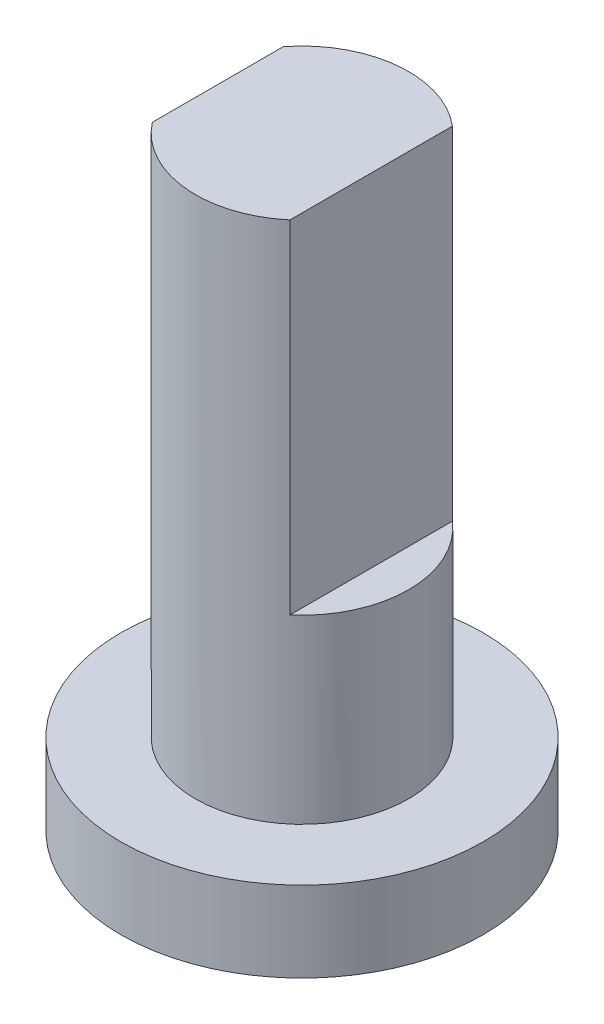
ISO-10303-21;
HEADER;
FILE_DESCRIPTION(('STEP AP214'),'2;1');
FILE_NAME('part.step','',(''),(''),'','','');
FILE_SCHEMA(('AUTOMOTIVE_DESIGN { 1 0 10303 214 1 1 1 1 }'));
ENDSEC;
DATA;
#1=APPLICATION_CONTEXT('core data for automotive mechanical design processes');
#2=APPLICATION_PROTOCOL_DEFINITION('international standard','automotive_design',2000,#1);
#3=PRODUCT_CONTEXT('',#1,'mechanical');
#4=PRODUCT('Part','Part','',(#3));
#5=PRODUCT_RELATED_PRODUCT_CATEGORY('part','',(#4));
#6=PRODUCT_DEFINITION_FORMATION('','',#4);
#7=PRODUCT_DEFINITION_CONTEXT('part definition',#1,'design');
#8=PRODUCT_DEFINITION('design','',#6,#7);
#9=PRODUCT_DEFINITION_SHAPE('','',#8);
#10=(LENGTH_UNIT() NAMED_UNIT(*) SI_UNIT(.MILLI.,.METRE.));
#11=(NAMED_UNIT(*) PLANE_ANGLE_UNIT() SI_UNIT($,.RADIAN.));
#12=(NAMED_UNIT(*) SI_UNIT($,.STERADIAN.) SOLID_ANGLE_UNIT());
#13=UNCERTAINTY_MEASURE_WITH_UNIT(LENGTH_MEASURE(1.E-05),#10,'distance_accuracy_value','');
#14=(GEOMETRIC_REPRESENTATION_CONTEXT(3) GLOBAL_UNCERTAINTY_ASSIGNED_CONTEXT((#13)) GLOBAL_UNIT_ASSIGNED_CONTEXT((#10,
#11,#12)) REPRESENTATION_CONTEXT('',''));
#15=CARTESIAN_POINT('',(0.,0.,0.));
#16=DIRECTION('',(0.,0.,1.));
#17=DIRECTION('',(1.,0.,0.));
#18=AXIS2_PLACEMENT_3D('',#15,#16,#17);
#19=CARTESIAN_POINT('',(0.,6.5,0.));
#20=DIRECTION('',(0.,1.,0.));
#21=DIRECTION('',(0.,0.,1.));
#22=AXIS2_PLACEMENT_3D('',#19,#20,#21);
#23=PLANE('',#22);
#24=DIRECTION('',(0.,0.,-1.));
#25=VECTOR('',#24,1.);
#26=CARTESIAN_POINT('',(1.7187276875559,6.5,2.0170461412741));
#27=LINE('',#26,#25);
#28=CARTESIAN_POINT('',(1.7187276875559,6.5,2.0170461412741));
#29=VERTEX_POINT('',#28);
#30=CARTESIAN_POINT('',(1.7187276875559,6.5,-2.0170461412741));
#31=VERTEX_POINT('',#30);
#32=EDGE_CURVE('E103',#29,#31,#27,.T.);
#33=ORIENTED_EDGE('',*,*,#32,.F.);
#34=CARTESIAN_POINT('',(0.,6.5,0.));
#35=DIRECTION('',(0.,1.,0.));
#36=DIRECTION('',(0.,0.,1.));
#37=AXIS2_PLACEMENT_3D('',#34,#35,#36);
#38=CIRCLE('',#37,2.65);
#39=EDGE_CURVE('E61',#29,#31,#38,.T.);
#40=ORIENTED_EDGE('',*,*,#39,.T.);
#41=EDGE_LOOP('',(#33,#40));
#42=FACE_BOUND('',#41,.T.);
#43=ADVANCED_FACE('F39',(#42),#23,.T.);
#44=CARTESIAN_POINT('',(0.,2.,0.));
#45=DIRECTION('',(0.,-1.,0.));
#46=DIRECTION('',(0.,0.,-1.));
#47=AXIS2_PLACEMENT_3D('',#44,#45,#46);
#48=CYLINDRICAL_SURFACE('',#47,4.5);
#49=CARTESIAN_POINT('',(0.,2.,0.));
#50=DIRECTION('',(0.,1.,0.));
#51=DIRECTION('',(0.,0.,1.));
#52=AXIS2_PLACEMENT_3D('',#49,#50,#51);
#53=CIRCLE('',#52,4.5);
#54=CARTESIAN_POINT('',(0.,2.,4.5));
#55=VERTEX_POINT('',#54);
#56=EDGE_CURVE('E48',#55,#55,#53,.T.);
#57=ORIENTED_EDGE('',*,*,#56,.F.);
#58=EDGE_LOOP('',(#57));
#59=FACE_BOUND('',#58,.T.);
#60=CARTESIAN_POINT('',(0.,0.,0.));
#61=DIRECTION('',(0.,1.,0.));
#62=DIRECTION('',(0.,0.,1.));
#63=AXIS2_PLACEMENT_3D('',#60,#61,#62);
#64=CIRCLE('',#63,4.5);
#65=CARTESIAN_POINT('',(0.,0.,4.5));
#66=VERTEX_POINT('',#65);
#67=EDGE_CURVE('E43',#66,#66,#64,.T.);
#68=ORIENTED_EDGE('',*,*,#67,.T.);
#69=EDGE_LOOP('',(#68));
#70=FACE_BOUND('',#69,.T.);
#71=ADVANCED_FACE('F41',(#59,#70),#48,.T.);
#72=CARTESIAN_POINT('',(0.,2.,0.));
#73=DIRECTION('',(0.,1.,0.));
#74=DIRECTION('',(0.,0.,1.));
#75=AXIS2_PLACEMENT_3D('',#72,#73,#74);
#76=PLANE('',#75);
#77=CARTESIAN_POINT('',(0.,2.,0.));
#78=DIRECTION('',(0.,1.,0.));
#79=DIRECTION('',(0.,0.,1.));
#80=AXIS2_PLACEMENT_3D('',#77,#78,#79);
#81=CIRCLE('',#80,2.65);
#82=CARTESIAN_POINT('',(0.,2.,2.65));
#83=VERTEX_POINT('',#82);
#84=EDGE_CURVE('E11',#83,#83,#81,.T.);
#85=ORIENTED_EDGE('',*,*,#84,.F.);
#86=EDGE_LOOP('',(#85));
#87=FACE_BOUND('',#86,.T.);
#88=ORIENTED_EDGE('',*,*,#56,.T.);
#89=EDGE_LOOP('',(#88));
#90=FACE_BOUND('',#89,.T.);
#91=ADVANCED_FACE('F119',(#87,#90),#76,.T.);
#92=CARTESIAN_POINT('',(0.,0.,0.));
#93=DIRECTION('',(0.,1.,0.));
#94=DIRECTION('',(0.,0.,1.));
#95=AXIS2_PLACEMENT_3D('',#92,#93,#94);
#96=PLANE('',#95);
#97=ORIENTED_EDGE('',*,*,#67,.F.);
#98=EDGE_LOOP('',(#97));
#99=FACE_BOUND('',#98,.T.);
#100=ADVANCED_FACE('F117',(#99),#96,.F.);
#101=CARTESIAN_POINT('',(0.,6.5,0.));
#102=DIRECTION('',(0.,-1.,0.));
#103=DIRECTION('',(0.,0.,-1.));
#104=AXIS2_PLACEMENT_3D('',#101,#102,#103);
#105=CYLINDRICAL_SURFACE('',#104,2.65);
#106=ORIENTED_EDGE('',*,*,#39,.F.);
#107=DIRECTION('',(0.,-1.,0.));
#108=VECTOR('',#107,1.);
#109=CARTESIAN_POINT('',(1.7187276875559,15.,2.0170461412741));
#110=LINE('',#109,#108);
#111=CARTESIAN_POINT('',(1.7187276875559,15.,2.0170461412741));
#112=VERTEX_POINT('',#111);
#113=EDGE_CURVE('E108',#112,#29,#110,.T.);
#114=ORIENTED_EDGE('',*,*,#113,.F.);
#115=CARTESIAN_POINT('',(0.,15.,0.));
#116=DIRECTION('',(0.,1.,0.));
#117=DIRECTION('',(0.,0.,1.));
#118=AXIS2_PLACEMENT_3D('',#115,#116,#117);
#119=CIRCLE('',#118,2.65);
#120=CARTESIAN_POINT('',(-2.0912723124441,15.,1.62759949471752));
#121=VERTEX_POINT('',#120);
#122=EDGE_CURVE('E92',#121,#112,#119,.T.);
#123=ORIENTED_EDGE('',*,*,#122,.F.);
#124=DIRECTION('',(0.,-1.,0.));
#125=VECTOR('',#124,1.);
#126=CARTESIAN_POINT('',(-2.0912723124441,15.,1.62759949471752));
#127=LINE('',#126,#125);
#128=CARTESIAN_POINT('',(-2.0912723124441,6.5,1.62759949471752));
#129=VERTEX_POINT('',#128);
#130=EDGE_CURVE('E90',#121,#129,#127,.T.);
#131=ORIENTED_EDGE('',*,*,#130,.T.);
#132=CARTESIAN_POINT('',(-2.0912723124441,6.5,-1.62759949471752));
#133=VERTEX_POINT('',#132);
#134=EDGE_CURVE('E102',#133,#129,#38,.T.);
#135=ORIENTED_EDGE('',*,*,#134,.F.);
#136=DIRECTION('',(0.,-1.,0.));
#137=VECTOR('',#136,1.);
#138=CARTESIAN_POINT('',(-2.0912723124441,15.,-1.62759949471752));
#139=LINE('',#138,#137);
#140=CARTESIAN_POINT('',(-2.0912723124441,15.,-1.62759949471752));
#141=VERTEX_POINT('',#140);
#142=EDGE_CURVE('E87',#141,#133,#139,.T.);
#143=ORIENTED_EDGE('',*,*,#142,.F.);
#144=CARTESIAN_POINT('',(0.,15.,0.));
#145=DIRECTION('',(0.,1.,0.));
#146=DIRECTION('',(0.,0.,1.));
#147=AXIS2_PLACEMENT_3D('',#144,#145,#146);
#148=CIRCLE('',#147,2.65);
#149=CARTESIAN_POINT('',(1.7187276875559,15.,-2.0170461412741));
#150=VERTEX_POINT('',#149);
#151=EDGE_CURVE('E94',#150,#141,#148,.T.);
#152=ORIENTED_EDGE('',*,*,#151,.F.);
#153=DIRECTION('',(0.,-1.,0.));
#154=VECTOR('',#153,1.);
#155=CARTESIAN_POINT('',(1.7187276875559,15.,-2.0170461412741));
#156=LINE('',#155,#154);
#157=EDGE_CURVE('E202',#150,#31,#156,.T.);
#158=ORIENTED_EDGE('',*,*,#157,.T.);
#159=EDGE_LOOP('',(#106,#114,#123,#131,#135,#143,#152,#158));
#160=FACE_BOUND('',#159,.T.);
#161=ORIENTED_EDGE('',*,*,#84,.T.);
#162=EDGE_LOOP('',(#161));
#163=FACE_BOUND('',#162,.T.);
#164=ADVANCED_FACE('F101',(#160,#163),#105,.T.);
#165=DIRECTION('',(0.,0.,1.));
#166=VECTOR('',#165,1.);
#167=CARTESIAN_POINT('',(-2.0912723124441,6.5,-1.62759949471752));
#168=LINE('',#167,#166);
#169=EDGE_CURVE('E54',#133,#129,#168,.T.);
#170=ORIENTED_EDGE('',*,*,#169,.F.);
#171=ORIENTED_EDGE('',*,*,#134,.T.);
#172=EDGE_LOOP('',(#170,#171));
#173=FACE_BOUND('',#172,.T.);
#174=ADVANCED_FACE('F129',(#173),#23,.T.);
#175=CARTESIAN_POINT('',(-2.0912723124441,15.,-1.62759949471752));
#176=DIRECTION('',(1.,0.,0.));
#177=DIRECTION('',(0.,0.,-1.));
#178=AXIS2_PLACEMENT_3D('',#175,#176,#177);
#179=PLANE('',#178);
#180=ORIENTED_EDGE('',*,*,#169,.T.);
#181=ORIENTED_EDGE('',*,*,#130,.F.);
#182=DIRECTION('',(0.,0.,1.));
#183=VECTOR('',#182,1.);
#184=CARTESIAN_POINT('',(-2.0912723124441,15.,-1.62759949471752));
#185=LINE('',#184,#183);
#186=EDGE_CURVE('E81',#141,#121,#185,.T.);
#187=ORIENTED_EDGE('',*,*,#186,.F.);
#188=ORIENTED_EDGE('',*,*,#142,.T.);
#189=EDGE_LOOP('',(#180,#181,#187,#188));
#190=FACE_BOUND('',#189,.T.);
#191=ADVANCED_FACE('F83',(#190),#179,.F.);
#192=CARTESIAN_POINT('',(1.7187276875559,15.,2.0170461412741));
#193=DIRECTION('',(-1.,0.,0.));
#194=DIRECTION('',(0.,0.,1.));
#195=AXIS2_PLACEMENT_3D('',#192,#193,#194);
#196=PLANE('',#195);
#197=ORIENTED_EDGE('',*,*,#32,.T.);
#198=ORIENTED_EDGE('',*,*,#157,.F.);
#199=DIRECTION('',(0.,0.,-1.));
#200=VECTOR('',#199,1.);
#201=CARTESIAN_POINT('',(1.7187276875559,15.,2.0170461412741));
#202=LINE('',#201,#200);
#203=EDGE_CURVE('E97',#112,#150,#202,.T.);
#204=ORIENTED_EDGE('',*,*,#203,.F.);
#205=ORIENTED_EDGE('',*,*,#113,.T.);
#206=EDGE_LOOP('',(#197,#198,#204,#205));
#207=FACE_BOUND('',#206,.T.);
#208=ADVANCED_FACE('F138',(#207),#196,.F.);
#209=CARTESIAN_POINT('',(0.,15.,0.));
#210=DIRECTION('',(0.,1.,0.));
#211=DIRECTION('',(0.,0.,1.));
#212=AXIS2_PLACEMENT_3D('',#209,#210,#211);
#213=PLANE('',#212);
#214=ORIENTED_EDGE('',*,*,#151,.T.);
#215=ORIENTED_EDGE('',*,*,#186,.T.);
#216=ORIENTED_EDGE('',*,*,#122,.T.);
#217=ORIENTED_EDGE('',*,*,#203,.T.);
#218=EDGE_LOOP('',(#214,#215,#216,#217));
#219=FACE_BOUND('',#218,.T.);
#220=ADVANCED_FACE('F93',(#219),#213,.T.);
#221=CLOSED_SHELL('',(#43,#71,#91,#100,#164,#174,#191,#208,#220));
#222=MANIFOLD_SOLID_BREP('B2',#221);
#223=ADVANCED_BREP_SHAPE_REPRESENTATION('',(#18,#222),#14);
#224=SHAPE_DEFINITION_REPRESENTATION(#9,#223);
ENDSEC;
END-ISO-10303-21;
